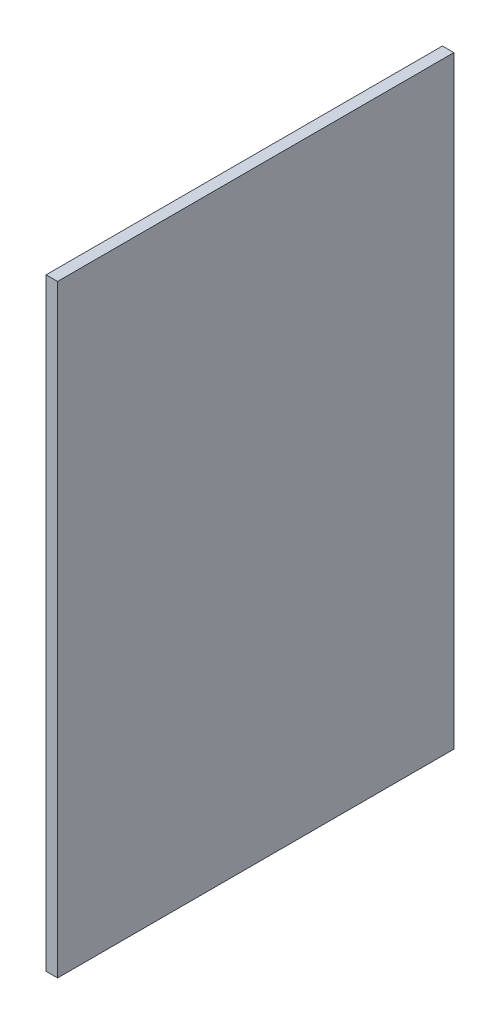
ISO-10303-21;
HEADER;
FILE_DESCRIPTION(('STEP AP214'),'2;1');
FILE_NAME('part.step','',(''),(''),'','','');
FILE_SCHEMA(('AUTOMOTIVE_DESIGN { 1 0 10303 214 1 1 1 1 }'));
ENDSEC;
DATA;
#1=APPLICATION_CONTEXT('core data for automotive mechanical design processes');
#2=APPLICATION_PROTOCOL_DEFINITION('international standard','automotive_design',2000,#1);
#3=PRODUCT_CONTEXT('',#1,'mechanical');
#4=PRODUCT('Part','Part','',(#3));
#5=PRODUCT_RELATED_PRODUCT_CATEGORY('part','',(#4));
#6=PRODUCT_DEFINITION_FORMATION('','',#4);
#7=PRODUCT_DEFINITION_CONTEXT('part definition',#1,'design');
#8=PRODUCT_DEFINITION('design','',#6,#7);
#9=PRODUCT_DEFINITION_SHAPE('','',#8);
#10=(LENGTH_UNIT() NAMED_UNIT(*) SI_UNIT(.MILLI.,.METRE.));
#11=(NAMED_UNIT(*) PLANE_ANGLE_UNIT() SI_UNIT($,.RADIAN.));
#12=(NAMED_UNIT(*) SI_UNIT($,.STERADIAN.) SOLID_ANGLE_UNIT());
#13=UNCERTAINTY_MEASURE_WITH_UNIT(LENGTH_MEASURE(1.E-05),#10,'distance_accuracy_value','');
#14=(GEOMETRIC_REPRESENTATION_CONTEXT(3) GLOBAL_UNCERTAINTY_ASSIGNED_CONTEXT((#13)) GLOBAL_UNIT_ASSIGNED_CONTEXT((#10,
#11,#12)) REPRESENTATION_CONTEXT('',''));
#15=CARTESIAN_POINT('',(0.,0.,0.));
#16=DIRECTION('',(0.,0.,1.));
#17=DIRECTION('',(1.,0.,0.));
#18=AXIS2_PLACEMENT_3D('',#15,#16,#17);
#19=CARTESIAN_POINT('',(3.,0.,0.));
#20=DIRECTION('',(0.,0.,-1.));
#21=DIRECTION('',(-1.,0.,0.));
#22=AXIS2_PLACEMENT_3D('',#19,#20,#21);
#23=PLANE('',#22);
#24=DIRECTION('',(0.,-1.,0.));
#25=VECTOR('',#24,1.);
#26=CARTESIAN_POINT('',(0.,0.,0.));
#27=LINE('',#26,#25);
#28=CARTESIAN_POINT('',(0.,157.719537065267,0.));
#29=VERTEX_POINT('',#28);
#30=CARTESIAN_POINT('',(0.,0.,0.));
#31=VERTEX_POINT('',#30);
#32=EDGE_CURVE('E96',#29,#31,#27,.T.);
#33=ORIENTED_EDGE('',*,*,#32,.T.);
#34=DIRECTION('',(-1.,0.,0.));
#35=VECTOR('',#34,1.);
#36=CARTESIAN_POINT('',(3.,0.,0.));
#37=LINE('',#36,#35);
#38=CARTESIAN_POINT('',(3.,0.,0.));
#39=VERTEX_POINT('',#38);
#40=EDGE_CURVE('E11',#39,#31,#37,.T.);
#41=ORIENTED_EDGE('',*,*,#40,.F.);
#42=DIRECTION('',(0.,-1.,0.));
#43=VECTOR('',#42,1.);
#44=CARTESIAN_POINT('',(3.,0.,0.));
#45=LINE('',#44,#43);
#46=CARTESIAN_POINT('',(3.,157.719537065267,0.));
#47=VERTEX_POINT('',#46);
#48=EDGE_CURVE('E84',#47,#39,#45,.T.);
#49=ORIENTED_EDGE('',*,*,#48,.F.);
#50=DIRECTION('',(-1.,0.,0.));
#51=VECTOR('',#50,1.);
#52=CARTESIAN_POINT('',(3.,157.719537065267,0.));
#53=LINE('',#52,#51);
#54=EDGE_CURVE('E92',#47,#29,#53,.T.);
#55=ORIENTED_EDGE('',*,*,#54,.T.);
#56=EDGE_LOOP('',(#33,#41,#49,#55));
#57=FACE_BOUND('',#56,.T.);
#58=ADVANCED_FACE('F33',(#57),#23,.F.);
#59=CARTESIAN_POINT('',(3.,0.,0.));
#60=DIRECTION('',(0.,1.,0.));
#61=DIRECTION('',(0.,0.,1.));
#62=AXIS2_PLACEMENT_3D('',#59,#60,#61);
#63=PLANE('',#62);
#64=DIRECTION('',(0.,0.,-1.));
#65=VECTOR('',#64,1.);
#66=CARTESIAN_POINT('',(0.,0.,0.));
#67=LINE('',#66,#65);
#68=CARTESIAN_POINT('',(0.,0.,-103.610699172251));
#69=VERTEX_POINT('',#68);
#70=EDGE_CURVE('E88',#31,#69,#67,.T.);
#71=ORIENTED_EDGE('',*,*,#70,.T.);
#72=DIRECTION('',(-1.,0.,0.));
#73=VECTOR('',#72,1.);
#74=CARTESIAN_POINT('',(3.,0.,-103.610699172251));
#75=LINE('',#74,#73);
#76=CARTESIAN_POINT('',(3.,0.,-103.610699172251));
#77=VERTEX_POINT('',#76);
#78=EDGE_CURVE('E41',#77,#69,#75,.T.);
#79=ORIENTED_EDGE('',*,*,#78,.F.);
#80=DIRECTION('',(0.,0.,-1.));
#81=VECTOR('',#80,1.);
#82=CARTESIAN_POINT('',(3.,0.,0.));
#83=LINE('',#82,#81);
#84=EDGE_CURVE('E79',#39,#77,#83,.T.);
#85=ORIENTED_EDGE('',*,*,#84,.F.);
#86=ORIENTED_EDGE('',*,*,#40,.T.);
#87=EDGE_LOOP('',(#71,#79,#85,#86));
#88=FACE_BOUND('',#87,.T.);
#89=ADVANCED_FACE('F87',(#88),#63,.F.);
#90=CARTESIAN_POINT('',(3.,0.,-103.610699172251));
#91=DIRECTION('',(0.,0.,1.));
#92=DIRECTION('',(1.,0.,0.));
#93=AXIS2_PLACEMENT_3D('',#90,#91,#92);
#94=PLANE('',#93);
#95=DIRECTION('',(0.,1.,0.));
#96=VECTOR('',#95,1.);
#97=CARTESIAN_POINT('',(0.,0.,-103.610699172251));
#98=LINE('',#97,#96);
#99=CARTESIAN_POINT('',(0.,157.719537065267,-103.610699172251));
#100=VERTEX_POINT('',#99);
#101=EDGE_CURVE('E66',#69,#100,#98,.T.);
#102=ORIENTED_EDGE('',*,*,#101,.T.);
#103=DIRECTION('',(-1.,0.,0.));
#104=VECTOR('',#103,1.);
#105=CARTESIAN_POINT('',(3.,157.719537065267,-103.610699172251));
#106=LINE('',#105,#104);
#107=CARTESIAN_POINT('',(3.,157.719537065267,-103.610699172251));
#108=VERTEX_POINT('',#107);
#109=EDGE_CURVE('E89',#108,#100,#106,.T.);
#110=ORIENTED_EDGE('',*,*,#109,.F.);
#111=DIRECTION('',(0.,1.,0.));
#112=VECTOR('',#111,1.);
#113=CARTESIAN_POINT('',(3.,0.,-103.610699172251));
#114=LINE('',#113,#112);
#115=EDGE_CURVE('E82',#77,#108,#114,.T.);
#116=ORIENTED_EDGE('',*,*,#115,.F.);
#117=ORIENTED_EDGE('',*,*,#78,.T.);
#118=EDGE_LOOP('',(#102,#110,#116,#117));
#119=FACE_BOUND('',#118,.T.);
#120=ADVANCED_FACE('F90',(#119),#94,.F.);
#121=CARTESIAN_POINT('',(3.,157.719537065267,0.));
#122=DIRECTION('',(0.,-1.,0.));
#123=DIRECTION('',(0.,0.,-1.));
#124=AXIS2_PLACEMENT_3D('',#121,#122,#123);
#125=PLANE('',#124);
#126=DIRECTION('',(0.,0.,1.));
#127=VECTOR('',#126,1.);
#128=CARTESIAN_POINT('',(0.,157.719537065267,0.));
#129=LINE('',#128,#127);
#130=EDGE_CURVE('E72',#100,#29,#129,.T.);
#131=ORIENTED_EDGE('',*,*,#130,.T.);
#132=ORIENTED_EDGE('',*,*,#54,.F.);
#133=DIRECTION('',(0.,0.,1.));
#134=VECTOR('',#133,1.);
#135=CARTESIAN_POINT('',(3.,157.719537065267,0.));
#136=LINE('',#135,#134);
#137=EDGE_CURVE('E49',#108,#47,#136,.T.);
#138=ORIENTED_EDGE('',*,*,#137,.F.);
#139=ORIENTED_EDGE('',*,*,#109,.T.);
#140=EDGE_LOOP('',(#131,#132,#138,#139));
#141=FACE_BOUND('',#140,.T.);
#142=ADVANCED_FACE('F103',(#141),#125,.F.);
#143=CARTESIAN_POINT('',(3.,0.,0.));
#144=DIRECTION('',(-1.,0.,0.));
#145=DIRECTION('',(0.,0.,1.));
#146=AXIS2_PLACEMENT_3D('',#143,#144,#145);
#147=PLANE('',#146);
#148=ORIENTED_EDGE('',*,*,#48,.T.);
#149=ORIENTED_EDGE('',*,*,#84,.T.);
#150=ORIENTED_EDGE('',*,*,#115,.T.);
#151=ORIENTED_EDGE('',*,*,#137,.T.);
#152=EDGE_LOOP('',(#148,#149,#150,#151));
#153=FACE_BOUND('',#152,.T.);
#154=ADVANCED_FACE('F80',(#153),#147,.F.);
#155=CARTESIAN_POINT('',(0.,0.,0.));
#156=DIRECTION('',(-1.,0.,0.));
#157=DIRECTION('',(0.,0.,1.));
#158=AXIS2_PLACEMENT_3D('',#155,#156,#157);
#159=PLANE('',#158);
#160=ORIENTED_EDGE('',*,*,#32,.F.);
#161=ORIENTED_EDGE('',*,*,#130,.F.);
#162=ORIENTED_EDGE('',*,*,#101,.F.);
#163=ORIENTED_EDGE('',*,*,#70,.F.);
#164=EDGE_LOOP('',(#160,#161,#162,#163));
#165=FACE_BOUND('',#164,.T.);
#166=ADVANCED_FACE('F106',(#165),#159,.T.);
#167=CLOSED_SHELL('',(#58,#89,#120,#142,#154,#166));
#168=MANIFOLD_SOLID_BREP('B2',#167);
#169=ADVANCED_BREP_SHAPE_REPRESENTATION('',(#18,#168),#14);
#170=SHAPE_DEFINITION_REPRESENTATION(#9,#169);
ENDSEC;
END-ISO-10303-21;
